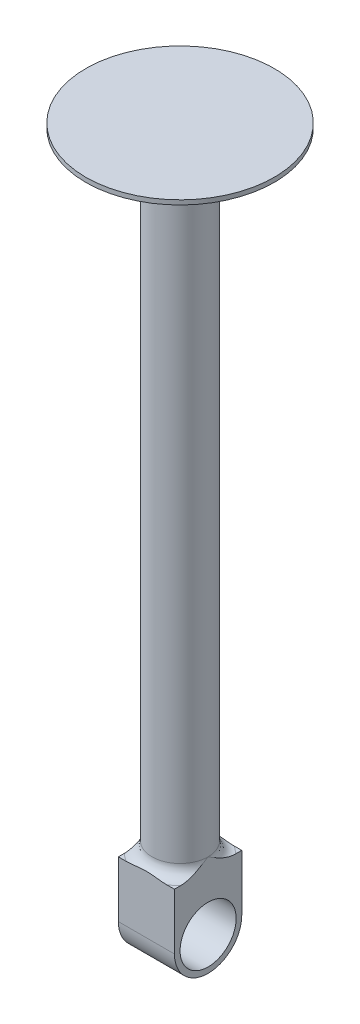
ISO-10303-21;
HEADER;
FILE_DESCRIPTION(('STEP AP214'),'2;1');
FILE_NAME('part.step','',(''),(''),'','','');
FILE_SCHEMA(('AUTOMOTIVE_DESIGN { 1 0 10303 214 1 1 1 1 }'));
ENDSEC;
DATA;
#1=APPLICATION_CONTEXT('core data for automotive mechanical design processes');
#2=APPLICATION_PROTOCOL_DEFINITION('international standard','automotive_design',2000,#1);
#3=PRODUCT_CONTEXT('',#1,'mechanical');
#4=PRODUCT('Part','Part','',(#3));
#5=PRODUCT_RELATED_PRODUCT_CATEGORY('part','',(#4));
#6=PRODUCT_DEFINITION_FORMATION('','',#4);
#7=PRODUCT_DEFINITION_CONTEXT('part definition',#1,'design');
#8=PRODUCT_DEFINITION('design','',#6,#7);
#9=PRODUCT_DEFINITION_SHAPE('','',#8);
#10=(LENGTH_UNIT() NAMED_UNIT(*) SI_UNIT(.MILLI.,.METRE.));
#11=(NAMED_UNIT(*) PLANE_ANGLE_UNIT() SI_UNIT($,.RADIAN.));
#12=(NAMED_UNIT(*) SI_UNIT($,.STERADIAN.) SOLID_ANGLE_UNIT());
#13=UNCERTAINTY_MEASURE_WITH_UNIT(LENGTH_MEASURE(1.E-05),#10,'distance_accuracy_value','');
#14=(GEOMETRIC_REPRESENTATION_CONTEXT(3) GLOBAL_UNCERTAINTY_ASSIGNED_CONTEXT((#13)) GLOBAL_UNIT_ASSIGNED_CONTEXT((#10,
#11,#12)) REPRESENTATION_CONTEXT('',''));
#15=CARTESIAN_POINT('',(0.,0.,0.));
#16=DIRECTION('',(0.,0.,1.));
#17=DIRECTION('',(1.,0.,0.));
#18=AXIS2_PLACEMENT_3D('',#15,#16,#17);
#19=CARTESIAN_POINT('',(-25.,0.,0.));
#20=DIRECTION('',(1.,0.,0.));
#21=DIRECTION('',(0.,0.,-1.));
#22=AXIS2_PLACEMENT_3D('',#19,#20,#21);
#23=CYLINDRICAL_SURFACE('',#22,12.5);
#24=CARTESIAN_POINT('',(0.,0.,0.));
#25=DIRECTION('',(1.,0.,0.));
#26=DIRECTION('',(0.,0.,-1.));
#27=AXIS2_PLACEMENT_3D('',#24,#25,#26);
#28=CIRCLE('',#27,12.5);
#29=CARTESIAN_POINT('',(0.,0.,-12.5));
#30=VERTEX_POINT('',#29);
#31=EDGE_CURVE('E249',#30,#30,#28,.T.);
#32=ORIENTED_EDGE('',*,*,#31,.T.);
#33=EDGE_LOOP('',(#32));
#34=FACE_BOUND('',#33,.T.);
#35=CARTESIAN_POINT('',(-25.,0.,0.));
#36=DIRECTION('',(1.,0.,0.));
#37=DIRECTION('',(0.,0.,-1.));
#38=AXIS2_PLACEMENT_3D('',#35,#36,#37);
#39=CIRCLE('',#38,12.5);
#40=CARTESIAN_POINT('',(-25.,0.,-12.5));
#41=VERTEX_POINT('',#40);
#42=EDGE_CURVE('E255',#41,#41,#39,.T.);
#43=ORIENTED_EDGE('',*,*,#42,.F.);
#44=EDGE_LOOP('',(#43));
#45=FACE_BOUND('',#44,.T.);
#46=DIRECTION('',(1.,0.,0.));
#47=VECTOR('',#46,1.);
#48=CARTESIAN_POINT('',(-25.,5.,11.4564392373896));
#49=LINE('',#48,#47);
#50=CARTESIAN_POINT('',(-11.5,5.,11.4564392373896));
#51=VERTEX_POINT('',#50);
#52=CARTESIAN_POINT('',(-13.5,5.,11.4564392373896));
#53=VERTEX_POINT('',#52);
#54=EDGE_CURVE('E11',#51,#53,#49,.F.);
#55=ORIENTED_EDGE('',*,*,#54,.F.);
#56=CARTESIAN_POINT('',(-11.5,5.,11.4564392373896));
#57=CARTESIAN_POINT('',(-11.2728740040052,5.04542239381407,11.4366154402754));
#58=CARTESIAN_POINT('',(-11.0498560865749,5.10491098108189,11.4103444459568));
#59=CARTESIAN_POINT('',(-10.6136001667364,5.24557323748497,11.3463573657923));
#60=CARTESIAN_POINT('',(-10.4003191938273,5.32663803601033,11.3086986146047));
#61=CARTESIAN_POINT('',(-9.98525926448562,5.50354584966557,11.223658522204));
#62=CARTESIAN_POINT('',(-9.78337570123816,5.59920682784008,11.1763948405651));
#63=CARTESIAN_POINT('',(-9.3873748171941,5.80167688837728,11.0726467235668));
#64=CARTESIAN_POINT('',(-9.19327019747175,5.90850325096414,11.0161479168376));
#65=CARTESIAN_POINT('',(-8.83517899466781,6.11656099572706,10.9018368189254));
#66=CARTESIAN_POINT('',(-8.67037200150876,6.21692712267834,10.8449945065685));
#67=CARTESIAN_POINT('',(-8.34583126530105,6.42194190502209,10.7248684907105));
#68=CARTESIAN_POINT('',(-8.18609838271885,6.52659127995346,10.6615837022662));
#69=CARTESIAN_POINT('',(-7.71384849643815,6.84491237033914,10.4622981138137));
#70=CARTESIAN_POINT('',(-7.40823536498399,7.06298405631725,10.316851588169));
#71=CARTESIAN_POINT('',(-6.81049522893945,7.50532991765513,9.99974847471668));
#72=CARTESIAN_POINT('',(-6.51852316923542,7.72964325473879,9.82785693609712));
#73=CARTESIAN_POINT('',(-5.95033772711238,8.1772561043656,9.45868118714949));
#74=CARTESIAN_POINT('',(-5.67412200183603,8.40055576306695,9.26140076625061));
#75=CARTESIAN_POINT('',(-5.11860923289969,8.85767052498424,8.82600089710703));
#76=CARTESIAN_POINT('',(-4.8404866118762,9.09110610627451,8.58597608733979));
#77=CARTESIAN_POINT('',(-4.30401074615692,9.54748193271164,8.07544749999353));
#78=CARTESIAN_POINT('',(-4.04566222574169,9.77041966492576,7.80493647680576));
#79=CARTESIAN_POINT('',(-3.55271011647963,10.1999745333179,7.23445708781987));
#80=CARTESIAN_POINT('',(-3.31798854090342,10.4066715047072,6.9346515150957));
#81=CARTESIAN_POINT('',(-2.87439966743481,10.8000788658452,6.30444735770077));
#82=CARTESIAN_POINT('',(-2.66551448072163,10.9868030722595,5.97407022065014));
#83=CARTESIAN_POINT('',(-2.34957971032795,11.2706776970793,5.4112216255197));
#84=CARTESIAN_POINT('',(-2.23340977772725,11.3754424876501,5.1876491879203));
#85=CARTESIAN_POINT('',(-2.01435486415353,11.5735285646919,4.72924184027501));
#86=CARTESIAN_POINT('',(-1.91146587027073,11.6668533074062,4.49441036176179));
#87=CARTESIAN_POINT('',(-1.72027156466832,11.8406485813402,4.01425316140931));
#88=CARTESIAN_POINT('',(-1.6319664115575,11.9211189727602,3.76892732547358));
#89=CARTESIAN_POINT('',(-1.47126406219106,12.0678058819668,3.26893345132516));
#90=CARTESIAN_POINT('',(-1.39886737697971,12.1340219418453,3.01426511330014));
#91=CARTESIAN_POINT('',(-1.27074939200222,12.251342832933,2.49518028901518));
#92=CARTESIAN_POINT('',(-1.2151588277025,12.3023291565544,2.23070448571421));
#93=CARTESIAN_POINT('',(-1.12248645426238,12.387391809185,1.69583070885546));
#94=CARTESIAN_POINT('',(-1.08540458946939,12.4214681890397,1.42543275310716));
#95=CARTESIAN_POINT('',(-1.03055036566229,12.471894734772,0.88118435112723));
#96=CARTESIAN_POINT('',(-1.0127675767528,12.4882544753309,0.607335850726652));
#97=CARTESIAN_POINT('',(-0.996875062604844,12.5028745822008,0.0585984058329272));
#98=CARTESIAN_POINT('',(-0.99876337631593,12.5011367526939,-0.216290432215732));
#99=CARTESIAN_POINT('',(-1.02082714997337,12.4808411251686,-0.733311953360356));
#100=CARTESIAN_POINT('',(-1.03889910023941,12.4642180853733,-0.975615572633627));
#101=CARTESIAN_POINT('',(-1.09013205286533,12.4171246435819,-1.45723954147197));
#102=CARTESIAN_POINT('',(-1.12329169105975,12.3866554934932,-1.69656015873813));
#103=CARTESIAN_POINT('',(-1.20415163592183,12.3124300380011,-2.17063183615225));
#104=CARTESIAN_POINT('',(-1.25185247803207,12.2686732433144,-2.40538272769306));
#105=CARTESIAN_POINT('',(-1.36105900221549,12.1686288252706,-2.86891984323233));
#106=CARTESIAN_POINT('',(-1.42256536490273,12.1123405841127,-3.09770577253645));
#107=CARTESIAN_POINT('',(-1.55960690210822,11.9871352998546,-3.55175106890628));
#108=CARTESIAN_POINT('',(-1.63535096305812,11.9180304521317,-3.77689528785399));
#109=CARTESIAN_POINT('',(-1.79924772664514,11.7688125978446,-4.21894527719511));
#110=CARTESIAN_POINT('',(-1.88740517730516,11.688695379417,-4.43584785472547));
#111=CARTESIAN_POINT('',(-2.07512862991007,11.518522976182,-4.86065773599934));
#112=CARTESIAN_POINT('',(-2.17469653109244,11.428466137045,-5.06856353429742));
#113=CARTESIAN_POINT('',(-2.38427253033225,11.2394792006493,-5.47488249521318));
#114=CARTESIAN_POINT('',(-2.49428283958546,11.1405472243115,-5.67329363388356));
#115=CARTESIAN_POINT('',(-2.78101579756932,10.8836028898364,-6.15669786635003));
#116=CARTESIAN_POINT('',(-2.96367823108143,10.7207039938588,-6.43560211221801));
#117=CARTESIAN_POINT('',(-3.34770050180345,10.3805889726437,-6.97094237944979));
#118=CARTESIAN_POINT('',(-3.54906823916317,10.2033668021418,-7.22736881766987));
#119=CARTESIAN_POINT('',(-3.96856576585294,9.83741962743175,-7.71809468994671));
#120=CARTESIAN_POINT('',(-4.18672062798082,9.64867750782822,-7.95235981379859));
#121=CARTESIAN_POINT('',(-4.63779237881762,9.26286339918523,-8.3985918566529));
#122=CARTESIAN_POINT('',(-4.87070720323347,9.06579257625684,-8.6105618828135));
#123=CARTESIAN_POINT('',(-5.3555927998184,8.66164945983531,-9.01719573716815));
#124=CARTESIAN_POINT('',(-5.60787421465243,8.45445192728502,-9.21136350117502));
#125=CARTESIAN_POINT('',(-6.12623855850397,8.03747833840816,-9.57736280216772));
#126=CARTESIAN_POINT('',(-6.39232464260466,7.82770170105596,-9.74918920124949));
#127=CARTESIAN_POINT('',(-6.93885345944115,7.40914194500368,-10.0709670996502));
#128=CARTESIAN_POINT('',(-7.21931539286914,7.2003605847804,-10.2208882561994));
#129=CARTESIAN_POINT('',(-7.79537704603918,6.78914860461928,-10.4985140719855));
#130=CARTESIAN_POINT('',(-8.09096884354462,6.58671474878903,-10.6262302071603));
#131=CARTESIAN_POINT('',(-8.57923099292969,6.27317637768589,-10.8127807152782));
#132=CARTESIAN_POINT('',(-8.76630608038481,6.15764959241839,-10.8788646687185));
#133=CARTESIAN_POINT('',(-9.14779353376644,5.93408246928659,-11.0024062208337));
#134=CARTESIAN_POINT('',(-9.34220813845065,5.82604444467316,-11.0598611603753));
#135=CARTESIAN_POINT('',(-9.73780372575917,5.62149932054787,-11.1652089707488));
#136=CARTESIAN_POINT('',(-9.93892952121163,5.52491860760054,-11.213164380457));
#137=CARTESIAN_POINT('',(-10.3497336944899,5.34691169636815,-11.2991279481419));
#138=CARTESIAN_POINT('',(-10.559401553518,5.26546750777402,-11.337147936847));
#139=CARTESIAN_POINT('',(-10.8917507833178,5.15500022450754,-11.387619048434));
#140=CARTESIAN_POINT('',(-11.0114712990799,5.11880810246956,-11.4039068804532));
#141=CARTESIAN_POINT('',(-11.2537559850222,5.05365380738767,-11.4329278072207));
#142=CARTESIAN_POINT('',(-11.3763290090656,5.02471877087496,-11.4456475802585));
#143=CARTESIAN_POINT('',(-11.5,5.,-11.4564392373896));
#144=B_SPLINE_CURVE_WITH_KNOTS('',3,(#56,#57,#58,#59,#60,#61,#62,#63,#64,#65,#66,#67,#68,#69,
#70,#71,#72,#73,#74,#75,#76,#77,#78,#79,#80,#81,#82,#83,#84,#85,#86,#87,#88,#89,#90,#91,#92,#93,
#94,#95,#96,#97,#98,#99,#100,#101,#102,#103,#104,#105,#106,#107,#108,#109,#110,#111,#112,#113,
#114,#115,#116,#117,#118,#119,#120,#121,#122,#123,#124,#125,#126,#127,#128,#129,#130,#131,#132,
#133,#134,#135,#136,#137,#138,#139,#140,#141,#142,#143),.UNSPECIFIED.,.F.,.F.,(4,2,2,2,2,2,2,2,
2,2,2,2,2,2,2,2,2,2,2,2,2,2,2,2,2,2,2,2,2,2,2,2,2,2,2,2,2,2,2,2,2,2,2,4),(0.,0.695839517983713,
1.38823238623275,2.07260590217581,2.75805473595694,3.36130605035763,3.96465912370432,
5.17120273874328,6.38916127817254,7.60693824101879,8.91120407605498,10.2157805501635,
11.5134802910089,12.8102764288754,13.6281841156786,14.4458440857037,15.26351294773,
16.081208072745,16.9051094419023,17.7290083337104,18.5524617396799,19.3758330547652,
20.1055936668308,20.8352883101104,21.5650098257716,22.2947673247076,23.0362112954698,
23.7779396369303,24.5197916168004,25.2618010368823,26.3733305169624,27.4853316025901,
28.5990270419995,29.7125670649191,30.8511353894104,31.9899650921537,33.1303576241473,
34.270159018248,34.9586109325505,35.6472745680922,36.3312416796435,37.0143905987802,
37.3925103506863,37.7720236104744),.UNSPECIFIED.);
#145=CARTESIAN_POINT('',(-11.5,5.,-11.4564392373896));
#146=VERTEX_POINT('',#145);
#147=EDGE_CURVE('E43',#51,#146,#144,.T.);
#148=ORIENTED_EDGE('',*,*,#147,.T.);
#149=DIRECTION('',(1.,0.,0.));
#150=VECTOR('',#149,1.);
#151=CARTESIAN_POINT('',(-25.,5.,-11.4564392373896));
#152=LINE('',#151,#150);
#153=CARTESIAN_POINT('',(-13.5,5.,-11.4564392373896));
#154=VERTEX_POINT('',#153);
#155=EDGE_CURVE('E133',#154,#146,#152,.T.);
#156=ORIENTED_EDGE('',*,*,#155,.F.);
#157=CARTESIAN_POINT('',(-13.5,5.,-11.4564392373896));
#158=CARTESIAN_POINT('',(-13.7271259959948,5.04542239381406,-11.4366154402754));
#159=CARTESIAN_POINT('',(-13.9501439134251,5.10491098108189,-11.4103444459568));
#160=CARTESIAN_POINT('',(-14.3863998332636,5.24557323748497,-11.3463573657923));
#161=CARTESIAN_POINT('',(-14.5996808061727,5.32663803601033,-11.3086986146047));
#162=CARTESIAN_POINT('',(-15.0147407355144,5.50354584966558,-11.223658522204));
#163=CARTESIAN_POINT('',(-15.2166242987618,5.59920682784008,-11.1763948405651));
#164=CARTESIAN_POINT('',(-15.6126251828059,5.80167688837728,-11.0726467235668));
#165=CARTESIAN_POINT('',(-15.8067298025283,5.90850325096415,-11.0161479168376));
#166=CARTESIAN_POINT('',(-16.1648210053322,6.11656099572706,-10.9018368189254));
#167=CARTESIAN_POINT('',(-16.3296279984912,6.21692712267834,-10.8449945065685));
#168=CARTESIAN_POINT('',(-16.6541687346989,6.42194190502209,-10.7248684907105));
#169=CARTESIAN_POINT('',(-16.8139016172812,6.52659127995346,-10.6615837022662));
#170=CARTESIAN_POINT('',(-17.2861515035619,6.84491237033914,-10.4622981138137));
#171=CARTESIAN_POINT('',(-17.591764635016,7.06298405631725,-10.316851588169));
#172=CARTESIAN_POINT('',(-18.1895047710605,7.50532991765513,-9.99974847471668));
#173=CARTESIAN_POINT('',(-18.4814768307646,7.7296432547388,-9.82785693609712));
#174=CARTESIAN_POINT('',(-19.0496622728876,8.1772561043656,-9.45868118714949));
#175=CARTESIAN_POINT('',(-19.325877998164,8.40055576306695,-9.26140076625061));
#176=CARTESIAN_POINT('',(-19.8813907671003,8.85767052498424,-8.82600089710703));
#177=CARTESIAN_POINT('',(-20.1595133881238,9.09110610627451,-8.58597608733979));
#178=CARTESIAN_POINT('',(-20.6959892538431,9.54748193271164,-8.07544749999352));
#179=CARTESIAN_POINT('',(-20.9543377742583,9.77041966492577,-7.80493647680575));
#180=CARTESIAN_POINT('',(-21.4472898835204,10.1999745333179,-7.23445708781986));
#181=CARTESIAN_POINT('',(-21.6820114590966,10.4066715047072,-6.93465151509569));
#182=CARTESIAN_POINT('',(-22.1256003325652,10.8000788658452,-6.30444735770076));
#183=CARTESIAN_POINT('',(-22.3344855192784,10.9868030722595,-5.97407022065013));
#184=CARTESIAN_POINT('',(-22.6504202896721,11.2706776970793,-5.41122162551969));
#185=CARTESIAN_POINT('',(-22.7665902222728,11.3754424876501,-5.18764918792029));
#186=CARTESIAN_POINT('',(-22.9856451358465,11.5735285646919,-4.72924184027501));
#187=CARTESIAN_POINT('',(-23.0885341297293,11.6668533074062,-4.49441036176178));
#188=CARTESIAN_POINT('',(-23.2797284353317,11.8406485813402,-4.0142531614093));
#189=CARTESIAN_POINT('',(-23.3680335884425,11.9211189727602,-3.76892732547358));
#190=CARTESIAN_POINT('',(-23.5287359378089,12.0678058819668,-3.26893345132516));
#191=CARTESIAN_POINT('',(-23.6011326230203,12.1340219418453,-3.01426511330013));
#192=CARTESIAN_POINT('',(-23.7292506079978,12.251342832933,-2.49518028901517));
#193=CARTESIAN_POINT('',(-23.7848411722975,12.3023291565544,-2.23070448571421));
#194=CARTESIAN_POINT('',(-23.8775135457376,12.387391809185,-1.69583070885546));
#195=CARTESIAN_POINT('',(-23.9145954105306,12.4214681890397,-1.42543275310716));
#196=CARTESIAN_POINT('',(-23.9694496343377,12.471894734772,-0.881184351127229));
#197=CARTESIAN_POINT('',(-23.9872324232472,12.4882544753309,-0.607335850726652));
#198=CARTESIAN_POINT('',(-24.0031249373952,12.5028745822008,-0.0585984058329279));
#199=CARTESIAN_POINT('',(-24.0012366236841,12.5011367526939,0.216290432215731));
#200=CARTESIAN_POINT('',(-23.9791728500266,12.4808411251686,0.733311953360354));
#201=CARTESIAN_POINT('',(-23.9611008997606,12.4642180853733,0.975615572633624));
#202=CARTESIAN_POINT('',(-23.9098679471347,12.4171246435819,1.45723954147196));
#203=CARTESIAN_POINT('',(-23.8767083089403,12.3866554934932,1.69656015873813));
#204=CARTESIAN_POINT('',(-23.7958483640782,12.3124300380011,2.17063183615224));
#205=CARTESIAN_POINT('',(-23.7481475219679,12.2686732433144,2.40538272769305));
#206=CARTESIAN_POINT('',(-23.6389409977845,12.1686288252706,2.86891984323233));
#207=CARTESIAN_POINT('',(-23.5774346350973,12.1123405841127,3.09770577253645));
#208=CARTESIAN_POINT('',(-23.4403930978918,11.9871352998546,3.55175106890628));
#209=CARTESIAN_POINT('',(-23.3646490369419,11.9180304521317,3.77689528785399));
#210=CARTESIAN_POINT('',(-23.2007522733549,11.7688125978446,4.21894527719511));
#211=CARTESIAN_POINT('',(-23.1125948226948,11.688695379417,4.43584785472546));
#212=CARTESIAN_POINT('',(-22.9248713700899,11.518522976182,4.86065773599933));
#213=CARTESIAN_POINT('',(-22.8253034689076,11.428466137045,5.06856353429742));
#214=CARTESIAN_POINT('',(-22.6157274696677,11.2394792006493,5.47488249521318));
#215=CARTESIAN_POINT('',(-22.5057171604145,11.1405472243115,5.67329363388356));
#216=CARTESIAN_POINT('',(-22.2189842024307,10.8836028898364,6.15669786635003));
#217=CARTESIAN_POINT('',(-22.0363217689186,10.7207039938588,6.43560211221801));
#218=CARTESIAN_POINT('',(-21.6522994981966,10.3805889726437,6.97094237944978));
#219=CARTESIAN_POINT('',(-21.4509317608368,10.2033668021418,7.22736881766986));
#220=CARTESIAN_POINT('',(-21.0314342341471,9.83741962743176,7.7180946899467));
#221=CARTESIAN_POINT('',(-20.8132793720192,9.64867750782822,7.95235981379859));
#222=CARTESIAN_POINT('',(-20.3622076211824,9.26286339918523,8.3985918566529));
#223=CARTESIAN_POINT('',(-20.1292927967665,9.06579257625685,8.6105618828135));
#224=CARTESIAN_POINT('',(-19.6444072001816,8.66164945983531,9.01719573716815));
#225=CARTESIAN_POINT('',(-19.3921257853476,8.45445192728502,9.21136350117502));
#226=CARTESIAN_POINT('',(-18.873761441496,8.03747833840816,9.57736280216771));
#227=CARTESIAN_POINT('',(-18.6076753573953,7.82770170105597,9.74918920124948));
#228=CARTESIAN_POINT('',(-18.0611465405589,7.40914194500369,10.0709670996502));
#229=CARTESIAN_POINT('',(-17.7806846071309,7.20036058478041,10.2208882561994));
#230=CARTESIAN_POINT('',(-17.2046229539608,6.78914860461928,10.4985140719855));
#231=CARTESIAN_POINT('',(-16.9090311564554,6.58671474878904,10.6262302071603));
#232=CARTESIAN_POINT('',(-16.4207690070703,6.27317637768589,10.8127807152782));
#233=CARTESIAN_POINT('',(-16.2336939196152,6.1576495924184,10.8788646687185));
#234=CARTESIAN_POINT('',(-15.8522064662336,5.93408246928659,11.0024062208337));
#235=CARTESIAN_POINT('',(-15.6577918615494,5.82604444467316,11.0598611603753));
#236=CARTESIAN_POINT('',(-15.2621962742408,5.62149932054787,11.1652089707488));
#237=CARTESIAN_POINT('',(-15.0610704787884,5.52491860760055,11.213164380457));
#238=CARTESIAN_POINT('',(-14.6502663055101,5.34691169636815,11.2991279481419));
#239=CARTESIAN_POINT('',(-14.440598446482,5.26546750777401,11.337147936847));
#240=CARTESIAN_POINT('',(-14.1082492166822,5.15500022450754,11.387619048434));
#241=CARTESIAN_POINT('',(-13.9885287009201,5.11880810246956,11.4039068804532));
#242=CARTESIAN_POINT('',(-13.7462440149778,5.05365380738767,11.4329278072207));
#243=CARTESIAN_POINT('',(-13.6236709909344,5.02471877087497,11.4456475802585));
#244=CARTESIAN_POINT('',(-13.5,5.,11.4564392373896));
#245=B_SPLINE_CURVE_WITH_KNOTS('',3,(#157,#158,#159,#160,#161,#162,#163,#164,#165,#166,#167,
#168,#169,#170,#171,#172,#173,#174,#175,#176,#177,#178,#179,#180,#181,#182,#183,#184,#185,#186,
#187,#188,#189,#190,#191,#192,#193,#194,#195,#196,#197,#198,#199,#200,#201,#202,#203,#204,#205,
#206,#207,#208,#209,#210,#211,#212,#213,#214,#215,#216,#217,#218,#219,#220,#221,#222,#223,#224,
#225,#226,#227,#228,#229,#230,#231,#232,#233,#234,#235,#236,#237,#238,#239,#240,#241,#242,#243,
#244),.UNSPECIFIED.,.F.,.F.,(4,2,2,2,2,2,2,2,2,2,2,2,2,2,2,2,2,2,2,2,2,2,2,2,2,2,2,2,2,2,2,2,2,
2,2,2,2,2,2,2,2,2,2,4),(0.,0.695839517983714,1.38823238623275,2.07260590217582,2.75805473595694,
3.36130605035763,3.96465912370433,5.17120273874328,6.38916127817254,7.60693824101879,
8.91120407605499,10.2157805501635,11.5134802910089,12.8102764288754,13.6281841156787,
14.4458440857037,15.26351294773,16.081208072745,16.9051094419023,17.7290083337104,
18.5524617396799,19.3758330547652,20.1055936668308,20.8352883101104,21.5650098257716,
22.2947673247076,23.0362112954697,23.7779396369303,24.5197916168004,25.2618010368823,
26.3733305169623,27.4853316025901,28.5990270419995,29.7125670649191,30.8511353894104,
31.9899650921537,33.1303576241473,34.270159018248,34.9586109325505,35.6472745680922,
36.3312416796435,37.0143905987802,37.3925103506863,37.7720236104744),.UNSPECIFIED.);
#246=EDGE_CURVE('E128',#154,#53,#245,.T.);
#247=ORIENTED_EDGE('',*,*,#246,.T.);
#248=EDGE_LOOP('',(#55,#148,#156,#247));
#249=FACE_BOUND('',#248,.T.);
#250=ADVANCED_FACE('F34',(#34,#45,#249),#23,.F.);
#251=CARTESIAN_POINT('',(-12.5,30.,0.));
#252=DIRECTION('',(0.,1.,0.));
#253=DIRECTION('',(0.,0.,1.));
#254=AXIS2_PLACEMENT_3D('',#251,#252,#253);
#255=TOROIDAL_SURFACE('',#254,17.5,5.);
#256=CARTESIAN_POINT('',(-21.51387818866,25.,-15.));
#257=CARTESIAN_POINT('',(-21.0950038378221,25.0000501276346,-15.));
#258=CARTESIAN_POINT('',(-20.6765744182583,25.013944856336,-15.));
#259=CARTESIAN_POINT('',(-19.8411641137872,25.0612794436267,-15.));
#260=CARTESIAN_POINT('',(-19.4241822209844,25.0947004370346,-15.));
#261=CARTESIAN_POINT('',(-18.5892064137597,25.1731826870119,-15.));
#262=CARTESIAN_POINT('',(-18.1712188793809,25.2183047998535,-15.));
#263=CARTESIAN_POINT('',(-17.3354698794261,25.3120426107479,-15.));
#264=CARTESIAN_POINT('',(-16.9177085823411,25.3606597670034,-15.));
#265=CARTESIAN_POINT('',(-16.0849924204971,25.4529396054772,-15.));
#266=CARTESIAN_POINT('',(-15.6700419027632,25.4966388783842,-15.));
#267=CARTESIAN_POINT('',(-15.0468329830221,25.5533432381571,-15.));
#268=CARTESIAN_POINT('',(-14.8389858454726,25.5707693698985,-15.));
#269=CARTESIAN_POINT('',(-14.4230165390977,25.6019105474394,-15.));
#270=CARTESIAN_POINT('',(-14.2148943789958,25.6156257082369,-15.));
#271=CARTESIAN_POINT('',(-13.7991543930238,25.6386627398711,-15.));
#272=CARTESIAN_POINT('',(-13.5915374476358,25.6480002437139,-15.));
#273=CARTESIAN_POINT('',(-13.1761419188188,25.6619121245783,-15.));
#274=CARTESIAN_POINT('',(-12.9683633356335,25.6664865087665,-15.));
#275=CARTESIAN_POINT('',(-12.5527496041894,25.6706481518719,-15.));
#276=CARTESIAN_POINT('',(-12.3449144545969,25.6702352807397,-15.));
#277=CARTESIAN_POINT('',(-11.9293168348246,25.6644487903035,-15.));
#278=CARTESIAN_POINT('',(-11.7215543643224,25.6590751932952,-15.));
#279=CARTESIAN_POINT('',(-11.1681502573562,25.6384611175918,-15.));
#280=CARTESIAN_POINT('',(-10.8226614815711,25.6190361947237,-15.));
#281=CARTESIAN_POINT('',(-10.1324801567527,25.5695595351963,-15.));
#282=CARTESIAN_POINT('',(-9.78778762283292,25.5395075984677,-15.));
#283=CARTESIAN_POINT('',(-9.09814359997528,25.4723551116409,-15.));
#284=CARTESIAN_POINT('',(-8.75319407561016,25.4352351135748,-15.));
#285=CARTESIAN_POINT('',(-8.06357718092725,25.3582841107538,-15.));
#286=CARTESIAN_POINT('',(-7.71890984077816,25.3184528468385,-15.));
#287=CARTESIAN_POINT('',(-7.02665185339485,25.2402859979805,-15.));
#288=CARTESIAN_POINT('',(-6.67905951923887,25.2019646271645,-15.));
#289=CARTESIAN_POINT('',(-5.98324076499566,25.1318178954902,-15.));
#290=CARTESIAN_POINT('',(-5.63501442576995,25.0999917577798,-15.));
#291=CARTESIAN_POINT('',(-4.9383512282267,25.0475491542006,-15.));
#292=CARTESIAN_POINT('',(-4.58991623656299,25.0269100345741,-15.));
#293=CARTESIAN_POINT('',(-3.89209336925033,25.0014950604482,-15.));
#294=CARTESIAN_POINT('',(-3.54270485464265,24.9967379189917,-15.));
#295=CARTESIAN_POINT('',(-3.19323196777712,25.0023306409643,-15.));
#296=B_SPLINE_CURVE_WITH_KNOTS('',3,(#256,#257,#258,#259,#260,#261,#262,#263,#264,#265,#266,
#267,#268,#269,#270,#271,#272,#273,#274,#275,#276,#277,#278,#279,#280,#281,#282,#283,#284,#285,
#286,#287,#288,#289,#290,#291,#292,#293,#294,#295),.UNSPECIFIED.,.F.,.F.,(4,2,2,2,2,2,2,2,2,2,2,
2,2,2,2,2,2,2,2,4),(0.,1.2557742047959,2.51033715262873,3.77156058646075,5.03331331670677,
6.28495196365701,6.91065295463471,7.53633455375279,8.15976444058162,8.78319338938949,
9.40663859498282,10.0300809985661,11.0679537915834,12.1058461251514,13.1466366315495,
14.1875267635786,15.2365969823997,16.2855416551851,17.3323541987987,18.3803997215399),.UNSPECIFIED.);
#297=CARTESIAN_POINT('',(-21.51387818866,25.,-15.));
#298=VERTEX_POINT('',#297);
#299=CARTESIAN_POINT('',(-3.48612181134002,25.,-15.));
#300=VERTEX_POINT('',#299);
#301=EDGE_CURVE('E195',#298,#300,#296,.T.);
#302=ORIENTED_EDGE('',*,*,#301,.F.);
#303=CARTESIAN_POINT('',(-12.5,25.,0.));
#304=DIRECTION('',(0.,1.,0.));
#305=DIRECTION('',(0.,0.,1.));
#306=AXIS2_PLACEMENT_3D('',#303,#304,#305);
#307=CIRCLE('',#306,17.5);
#308=CARTESIAN_POINT('',(-25.,25.,-12.2474487139159));
#309=VERTEX_POINT('',#308);
#310=EDGE_CURVE('E219',#309,#298,#307,.F.);
#311=ORIENTED_EDGE('',*,*,#310,.F.);
#312=CARTESIAN_POINT('',(-25.,25.,-12.2474487139159));
#313=CARTESIAN_POINT('',(-25.,25.0000033703014,-12.0786126410343));
#314=CARTESIAN_POINT('',(-25.,25.0041881494309,-11.909810622488));
#315=CARTESIAN_POINT('',(-25.,25.0204073865853,-11.5726522044278));
#316=CARTESIAN_POINT('',(-25.,25.0324385072044,-11.404295645995));
#317=CARTESIAN_POINT('',(-25.,25.0794714626882,-10.9009564977467));
#318=CARTESIAN_POINT('',(-25.,25.1254173001425,-10.5669867731725));
#319=CARTESIAN_POINT('',(-25.,25.2994734375395,-9.58256242157538));
#320=CARTESIAN_POINT('',(-25.,25.4640708796591,-8.93847840020314));
#321=CARTESIAN_POINT('',(-25.,25.782892840217,-7.93625830967232));
#322=CARTESIAN_POINT('',(-25.,25.9132800335379,-7.56997691565989));
#323=CARTESIAN_POINT('',(-25.,26.1949330354161,-6.84547116096679));
#324=CARTESIAN_POINT('',(-25.,26.3461990955577,-6.48724689743264));
#325=CARTESIAN_POINT('',(-25.,26.665936634512,-5.77809035735199));
#326=CARTESIAN_POINT('',(-25.,26.8344306269647,-5.42716836278172));
#327=CARTESIAN_POINT('',(-25.,27.1850715085713,-4.73218094625973));
#328=CARTESIAN_POINT('',(-25.,27.3672205861135,-4.38811663456513));
#329=CARTESIAN_POINT('',(-25.,27.9324049211284,-3.35922026412901));
#330=CARTESIAN_POINT('',(-25.,28.331533052632,-2.68329464019022));
#331=CARTESIAN_POINT('',(-25.,29.1497662050445,-1.34453426367762));
#332=CARTESIAN_POINT('',(-25.,29.5688607304291,-0.681692886853363));
#333=CARTESIAN_POINT('',(-25.,29.9920318094424,-0.0125988169459396));
#334=CARTESIAN_POINT('',(-25.,29.9960159048341,-0.00629940907500695));
#335=CARTESIAN_POINT('',(-25.,30.,0.));
#336=B_SPLINE_CURVE_WITH_KNOTS('',3,(#312,#313,#314,#315,#316,#317,#318,#319,#320,#321,#322,
#323,#324,#325,#326,#327,#328,#329,#330,#331,#332,#333,#334,#335),.UNSPECIFIED.,.F.,.F.,(4,2,2,
2,2,2,2,2,2,2,2,4),(0.,0.506402523826368,1.01258979198716,2.02281953724405,4.01030959918914,
5.17623670193196,6.34217785497735,7.50966263302707,8.67733491590851,11.0312449799256,
13.3839310548634,13.4062917346492),.UNSPECIFIED.);
#337=CARTESIAN_POINT('',(-25.,30.,0.));
#338=VERTEX_POINT('',#337);
#339=EDGE_CURVE('E57',#309,#338,#336,.T.);
#340=ORIENTED_EDGE('',*,*,#339,.T.);
#341=CARTESIAN_POINT('',(-12.5,30.,0.));
#342=DIRECTION('',(0.,1.,0.));
#343=DIRECTION('',(0.,0.,1.));
#344=AXIS2_PLACEMENT_3D('',#341,#342,#343);
#345=CIRCLE('',#344,12.5);
#346=CARTESIAN_POINT('',(0.,30.,0.));
#347=VERTEX_POINT('',#346);
#348=EDGE_CURVE('E212',#347,#338,#345,.T.);
#349=ORIENTED_EDGE('',*,*,#348,.F.);
#350=CARTESIAN_POINT('',(0.,25.,-12.2474487139159));
#351=CARTESIAN_POINT('',(0.,25.0000033703014,-12.0786126410342));
#352=CARTESIAN_POINT('',(0.,25.0041881494309,-11.9098106224879));
#353=CARTESIAN_POINT('',(0.,25.0204073865853,-11.5726522044275));
#354=CARTESIAN_POINT('',(0.,25.0324385072044,-11.4042956459947));
#355=CARTESIAN_POINT('',(0.,25.0794714626882,-10.9009564977463));
#356=CARTESIAN_POINT('',(0.,25.1254173001425,-10.566986773172));
#357=CARTESIAN_POINT('',(0.,25.2994734375396,-9.58256242157499));
#358=CARTESIAN_POINT('',(0.,25.4640708796591,-8.93847840020295));
#359=CARTESIAN_POINT('',(0.,25.782892840217,-7.93625830967234));
#360=CARTESIAN_POINT('',(0.,25.9132800335379,-7.56997691565992));
#361=CARTESIAN_POINT('',(0.,26.1949330354161,-6.84547116096686));
#362=CARTESIAN_POINT('',(0.,26.3461990955577,-6.48724689743273));
#363=CARTESIAN_POINT('',(0.,26.665936634512,-5.77809035735214));
#364=CARTESIAN_POINT('',(0.,26.8344306269646,-5.42716836278191));
#365=CARTESIAN_POINT('',(0.,27.1850715085711,-4.73218094626004));
#366=CARTESIAN_POINT('',(0.,27.3672205861134,-4.38811663456551));
#367=CARTESIAN_POINT('',(0.,27.9324049211281,-3.35922026412926));
#368=CARTESIAN_POINT('',(0.,28.3315330526311,-2.68329464019003));
#369=CARTESIAN_POINT('',(0.,29.1497662050452,-1.34453426367827));
#370=CARTESIAN_POINT('',(0.,29.568860730432,-0.681692886855292));
#371=CARTESIAN_POINT('',(0.,29.9920318094425,-0.0125988169459874));
#372=CARTESIAN_POINT('',(0.,29.9960159048341,-0.00629940907503102));
#373=CARTESIAN_POINT('',(0.,30.,0.));
#374=B_SPLINE_CURVE_WITH_KNOTS('',3,(#350,#351,#352,#353,#354,#355,#356,#357,#358,#359,#360,
#361,#362,#363,#364,#365,#366,#367,#368,#369,#370,#371,#372,#373),.UNSPECIFIED.,.F.,.F.,(4,2,2,
2,2,2,2,2,2,2,2,4),(0.,0.506402523826534,1.0125897919875,2.02281953724464,4.01030959918914,
5.17623670193191,6.34217785497724,7.50966263302678,8.67733491590806,11.0312449799253,
13.3839310548633,13.4062917346492),.UNSPECIFIED.);
#375=CARTESIAN_POINT('',(0.,25.,-12.2474487139159));
#376=VERTEX_POINT('',#375);
#377=EDGE_CURVE('E135',#347,#376,#374,.F.);
#378=ORIENTED_EDGE('',*,*,#377,.T.);
#379=CARTESIAN_POINT('',(-12.5,25.,0.));
#380=DIRECTION('',(0.,1.,0.));
#381=DIRECTION('',(0.,0.,1.));
#382=AXIS2_PLACEMENT_3D('',#379,#380,#381);
#383=CIRCLE('',#382,17.5);
#384=EDGE_CURVE('E209',#300,#376,#383,.F.);
#385=ORIENTED_EDGE('',*,*,#384,.F.);
#386=EDGE_LOOP('',(#302,#311,#340,#349,#378,#385));
#387=FACE_BOUND('',#386,.T.);
#388=ADVANCED_FACE('F36',(#387),#255,.F.);
#389=CARTESIAN_POINT('',(0.,25.,0.));
#390=DIRECTION('',(0.,1.,0.));
#391=DIRECTION('',(0.,0.,1.));
#392=AXIS2_PLACEMENT_3D('',#389,#390,#391);
#393=PLANE('',#392);
#394=DIRECTION('',(0.,0.,1.));
#395=VECTOR('',#394,1.);
#396=CARTESIAN_POINT('',(-25.,25.,0.));
#397=LINE('',#396,#395);
#398=CARTESIAN_POINT('',(-25.,25.,-15.));
#399=VERTEX_POINT('',#398);
#400=EDGE_CURVE('E229',#399,#309,#397,.T.);
#401=ORIENTED_EDGE('',*,*,#400,.T.);
#402=ORIENTED_EDGE('',*,*,#310,.T.);
#403=DIRECTION('',(-1.,0.,0.));
#404=VECTOR('',#403,1.);
#405=CARTESIAN_POINT('',(0.,25.,-15.));
#406=LINE('',#405,#404);
#407=EDGE_CURVE('E224',#298,#399,#406,.T.);
#408=ORIENTED_EDGE('',*,*,#407,.T.);
#409=EDGE_LOOP('',(#401,#402,#408));
#410=FACE_BOUND('',#409,.T.);
#411=ADVANCED_FACE('F163',(#410),#393,.T.);
#412=CARTESIAN_POINT('',(-12.5,30.,0.));
#413=DIRECTION('',(0.,1.,0.));
#414=DIRECTION('',(0.,0.,1.));
#415=AXIS2_PLACEMENT_3D('',#412,#413,#414);
#416=TOROIDAL_SURFACE('',#415,17.5,5.);
#417=CARTESIAN_POINT('',(-3.48612181134002,25.,15.));
#418=CARTESIAN_POINT('',(-3.90499616217794,25.0000501276346,15.));
#419=CARTESIAN_POINT('',(-4.32342558174172,25.013944856336,15.));
#420=CARTESIAN_POINT('',(-5.1588358862128,25.0612794436267,15.));
#421=CARTESIAN_POINT('',(-5.57581777901557,25.0947004370346,15.));
#422=CARTESIAN_POINT('',(-6.41079358624034,25.1731826870119,15.));
#423=CARTESIAN_POINT('',(-6.8287811206191,25.2183047998535,15.));
#424=CARTESIAN_POINT('',(-7.66453012057385,25.3120426107479,15.));
#425=CARTESIAN_POINT('',(-8.08229141765892,25.3606597670034,15.));
#426=CARTESIAN_POINT('',(-8.91500757950288,25.4529396054772,15.));
#427=CARTESIAN_POINT('',(-9.32995809723683,25.4966388783842,15.));
#428=CARTESIAN_POINT('',(-9.95316701697788,25.5533432381571,15.));
#429=CARTESIAN_POINT('',(-10.1610141545274,25.5707693698985,15.));
#430=CARTESIAN_POINT('',(-10.5769834609024,25.6019105474394,15.));
#431=CARTESIAN_POINT('',(-10.7851056210042,25.6156257082369,15.));
#432=CARTESIAN_POINT('',(-11.2008456069762,25.6386627398711,15.));
#433=CARTESIAN_POINT('',(-11.4084625523642,25.6480002437139,15.));
#434=CARTESIAN_POINT('',(-11.8238580811812,25.6619121245783,15.));
#435=CARTESIAN_POINT('',(-12.0316366643665,25.6664865087665,15.));
#436=CARTESIAN_POINT('',(-12.4472503958106,25.6706481518719,15.));
#437=CARTESIAN_POINT('',(-12.6550855454031,25.6702352807397,15.));
#438=CARTESIAN_POINT('',(-13.0706831651754,25.6644487903035,15.));
#439=CARTESIAN_POINT('',(-13.2784456356776,25.6590751932952,15.));
#440=CARTESIAN_POINT('',(-13.8318497426438,25.6384611175918,15.));
#441=CARTESIAN_POINT('',(-14.1773385184289,25.6190361947237,15.));
#442=CARTESIAN_POINT('',(-14.8675198432473,25.5695595351963,15.));
#443=CARTESIAN_POINT('',(-15.2122123771671,25.5395075984677,15.));
#444=CARTESIAN_POINT('',(-15.9018564000247,25.4723551116409,15.));
#445=CARTESIAN_POINT('',(-16.2468059243898,25.4352351135748,15.));
#446=CARTESIAN_POINT('',(-16.9364228190727,25.3582841107538,15.));
#447=CARTESIAN_POINT('',(-17.2810901592218,25.3184528468385,15.));
#448=CARTESIAN_POINT('',(-17.9733481466051,25.2402859979805,15.));
#449=CARTESIAN_POINT('',(-18.3209404807611,25.2019646271645,15.));
#450=CARTESIAN_POINT('',(-19.0167592350043,25.1318178954902,15.));
#451=CARTESIAN_POINT('',(-19.36498557423,25.0999917577798,15.));
#452=CARTESIAN_POINT('',(-20.0616487717733,25.0475491542006,15.));
#453=CARTESIAN_POINT('',(-20.410083763437,25.0269100345741,15.));
#454=CARTESIAN_POINT('',(-21.1079066307497,25.0014950604482,15.));
#455=CARTESIAN_POINT('',(-21.4572951453573,24.9967379189917,15.));
#456=CARTESIAN_POINT('',(-21.8067680322229,25.0023306409643,15.));
#457=B_SPLINE_CURVE_WITH_KNOTS('',3,(#417,#418,#419,#420,#421,#422,#423,#424,#425,#426,#427,
#428,#429,#430,#431,#432,#433,#434,#435,#436,#437,#438,#439,#440,#441,#442,#443,#444,#445,#446,
#447,#448,#449,#450,#451,#452,#453,#454,#455,#456),.UNSPECIFIED.,.F.,.F.,(4,2,2,2,2,2,2,2,2,2,2,
2,2,2,2,2,2,2,2,4),(0.,1.2557742047959,2.51033715262873,3.77156058646074,5.03331331670677,
6.28495196365701,6.91065295463472,7.53633455375279,8.15976444058162,8.78319338938949,
9.40663859498282,10.0300809985661,11.0679537915834,12.1058461251514,13.1466366315495,
14.1875267635786,15.2365969823997,16.2855416551851,17.3323541987987,18.3803997215398),.UNSPECIFIED.);
#458=CARTESIAN_POINT('',(-3.48612181134002,25.,15.));
#459=VERTEX_POINT('',#458);
#460=CARTESIAN_POINT('',(-21.51387818866,25.,15.));
#461=VERTEX_POINT('',#460);
#462=EDGE_CURVE('E281',#459,#461,#457,.T.);
#463=ORIENTED_EDGE('',*,*,#462,.F.);
#464=CARTESIAN_POINT('',(-12.5,25.,0.));
#465=DIRECTION('',(0.,1.,0.));
#466=DIRECTION('',(0.,0.,1.));
#467=AXIS2_PLACEMENT_3D('',#464,#465,#466);
#468=CIRCLE('',#467,17.5);
#469=CARTESIAN_POINT('',(0.,25.,12.2474487139159));
#470=VERTEX_POINT('',#469);
#471=EDGE_CURVE('E272',#470,#459,#468,.F.);
#472=ORIENTED_EDGE('',*,*,#471,.F.);
#473=CARTESIAN_POINT('',(0.,25.,12.2474487139159));
#474=CARTESIAN_POINT('',(0.,25.0000033703014,12.0786126410342));
#475=CARTESIAN_POINT('',(0.,25.0041881494309,11.9098106224879));
#476=CARTESIAN_POINT('',(0.,25.0204073865853,11.5726522044275));
#477=CARTESIAN_POINT('',(0.,25.0324385072044,11.4042956459947));
#478=CARTESIAN_POINT('',(0.,25.0794714626882,10.9009564977463));
#479=CARTESIAN_POINT('',(0.,25.1254173001425,10.566986773172));
#480=CARTESIAN_POINT('',(0.,25.2994734375396,9.58256242157499));
#481=CARTESIAN_POINT('',(0.,25.4640708796591,8.93847840020295));
#482=CARTESIAN_POINT('',(0.,25.782892840217,7.93625830967234));
#483=CARTESIAN_POINT('',(0.,25.9132800335379,7.56997691565992));
#484=CARTESIAN_POINT('',(0.,26.1949330354161,6.84547116096686));
#485=CARTESIAN_POINT('',(0.,26.3461990955577,6.48724689743273));
#486=CARTESIAN_POINT('',(0.,26.665936634512,5.77809035735214));
#487=CARTESIAN_POINT('',(0.,26.8344306269646,5.42716836278191));
#488=CARTESIAN_POINT('',(0.,27.1850715085711,4.73218094626004));
#489=CARTESIAN_POINT('',(0.,27.3672205861134,4.38811663456551));
#490=CARTESIAN_POINT('',(0.,27.9324049211281,3.35922026412926));
#491=CARTESIAN_POINT('',(0.,28.3315330526311,2.68329464019003));
#492=CARTESIAN_POINT('',(0.,29.1497662050452,1.34453426367827));
#493=CARTESIAN_POINT('',(0.,29.568860730432,0.681692886855292));
#494=CARTESIAN_POINT('',(0.,29.9920318094425,0.0125988169459874));
#495=CARTESIAN_POINT('',(0.,29.9960159048341,0.00629940907503102));
#496=CARTESIAN_POINT('',(0.,30.,0.));
#497=B_SPLINE_CURVE_WITH_KNOTS('',3,(#473,#474,#475,#476,#477,#478,#479,#480,#481,#482,#483,
#484,#485,#486,#487,#488,#489,#490,#491,#492,#493,#494,#495,#496),.UNSPECIFIED.,.F.,.F.,(4,2,2,
2,2,2,2,2,2,2,2,4),(0.,0.506402523826534,1.0125897919875,2.02281953724464,4.01030959918914,
5.17623670193191,6.34217785497724,7.50966263302678,8.67733491590806,11.0312449799253,
13.3839310548633,13.4062917346492),.UNSPECIFIED.);
#498=EDGE_CURVE('E287',#470,#347,#497,.T.);
#499=ORIENTED_EDGE('',*,*,#498,.T.);
#500=CARTESIAN_POINT('',(-12.5,30.,0.));
#501=DIRECTION('',(0.,1.,0.));
#502=DIRECTION('',(0.,0.,1.));
#503=AXIS2_PLACEMENT_3D('',#500,#501,#502);
#504=CIRCLE('',#503,12.5);
#505=CARTESIAN_POINT('',(-6.0615155795289,30.,10.7142857142859));
#506=VERTEX_POINT('',#505);
#507=EDGE_CURVE('E278',#506,#347,#504,.T.);
#508=ORIENTED_EDGE('',*,*,#507,.F.);
#509=CARTESIAN_POINT('',(-12.5,30.,0.));
#510=DIRECTION('',(0.,1.,0.));
#511=DIRECTION('',(0.,0.,1.));
#512=AXIS2_PLACEMENT_3D('',#509,#510,#511);
#513=CIRCLE('',#512,12.5);
#514=EDGE_CURVE('E275',#338,#506,#513,.T.);
#515=ORIENTED_EDGE('',*,*,#514,.F.);
#516=CARTESIAN_POINT('',(-25.,25.,12.2474487139159));
#517=CARTESIAN_POINT('',(-25.,25.0000033703014,12.0786126410343));
#518=CARTESIAN_POINT('',(-25.,25.0041881494309,11.909810622488));
#519=CARTESIAN_POINT('',(-25.,25.0204073865853,11.5726522044278));
#520=CARTESIAN_POINT('',(-25.,25.0324385072044,11.404295645995));
#521=CARTESIAN_POINT('',(-25.,25.0794714626882,10.9009564977467));
#522=CARTESIAN_POINT('',(-25.,25.1254173001425,10.5669867731725));
#523=CARTESIAN_POINT('',(-25.,25.2994734375395,9.58256242157538));
#524=CARTESIAN_POINT('',(-25.,25.4640708796591,8.93847840020314));
#525=CARTESIAN_POINT('',(-25.,25.782892840217,7.93625830967232));
#526=CARTESIAN_POINT('',(-25.,25.9132800335379,7.56997691565989));
#527=CARTESIAN_POINT('',(-25.,26.1949330354161,6.84547116096679));
#528=CARTESIAN_POINT('',(-25.,26.3461990955577,6.48724689743264));
#529=CARTESIAN_POINT('',(-25.,26.665936634512,5.77809035735199));
#530=CARTESIAN_POINT('',(-25.,26.8344306269647,5.42716836278172));
#531=CARTESIAN_POINT('',(-25.,27.1850715085713,4.73218094625973));
#532=CARTESIAN_POINT('',(-25.,27.3672205861135,4.38811663456513));
#533=CARTESIAN_POINT('',(-25.,27.9324049211284,3.35922026412901));
#534=CARTESIAN_POINT('',(-25.,28.331533052632,2.68329464019022));
#535=CARTESIAN_POINT('',(-25.,29.1497662050445,1.34453426367762));
#536=CARTESIAN_POINT('',(-25.,29.5688607304291,0.681692886853363));
#537=CARTESIAN_POINT('',(-25.,29.9920318094424,0.0125988169459396));
#538=CARTESIAN_POINT('',(-25.,29.9960159048341,0.00629940907500695));
#539=CARTESIAN_POINT('',(-25.,30.,0.));
#540=B_SPLINE_CURVE_WITH_KNOTS('',3,(#516,#517,#518,#519,#520,#521,#522,#523,#524,#525,#526,
#527,#528,#529,#530,#531,#532,#533,#534,#535,#536,#537,#538,#539),.UNSPECIFIED.,.F.,.F.,(4,2,2,
2,2,2,2,2,2,2,2,4),(0.,0.506402523826368,1.01258979198716,2.02281953724405,4.01030959918914,
5.17623670193196,6.34217785497735,7.50966263302707,8.67733491590851,11.0312449799256,
13.3839310548634,13.4062917346492),.UNSPECIFIED.);
#541=CARTESIAN_POINT('',(-25.,25.,12.2474487139159));
#542=VERTEX_POINT('',#541);
#543=EDGE_CURVE('E182',#338,#542,#540,.F.);
#544=ORIENTED_EDGE('',*,*,#543,.T.);
#545=CARTESIAN_POINT('',(-12.5,25.,0.));
#546=DIRECTION('',(0.,1.,0.));
#547=DIRECTION('',(0.,0.,1.));
#548=AXIS2_PLACEMENT_3D('',#545,#546,#547);
#549=CIRCLE('',#548,17.5);
#550=EDGE_CURVE('E268',#461,#542,#549,.F.);
#551=ORIENTED_EDGE('',*,*,#550,.F.);
#552=EDGE_LOOP('',(#463,#472,#499,#508,#515,#544,#551));
#553=FACE_BOUND('',#552,.T.);
#554=ADVANCED_FACE('F295',(#553),#416,.F.);
#555=CARTESIAN_POINT('',(0.,25.,0.));
#556=DIRECTION('',(0.,1.,0.));
#557=DIRECTION('',(0.,0.,1.));
#558=AXIS2_PLACEMENT_3D('',#555,#556,#557);
#559=PLANE('',#558);
#560=DIRECTION('',(0.,0.,-1.));
#561=VECTOR('',#560,1.);
#562=CARTESIAN_POINT('',(0.,25.,0.));
#563=LINE('',#562,#561);
#564=CARTESIAN_POINT('',(0.,25.,15.));
#565=VERTEX_POINT('',#564);
#566=EDGE_CURVE('E239',#565,#470,#563,.T.);
#567=ORIENTED_EDGE('',*,*,#566,.T.);
#568=ORIENTED_EDGE('',*,*,#471,.T.);
#569=DIRECTION('',(1.,0.,0.));
#570=VECTOR('',#569,1.);
#571=CARTESIAN_POINT('',(0.,25.,15.));
#572=LINE('',#571,#570);
#573=EDGE_CURVE('E235',#459,#565,#572,.T.);
#574=ORIENTED_EDGE('',*,*,#573,.T.);
#575=EDGE_LOOP('',(#567,#568,#574));
#576=FACE_BOUND('',#575,.T.);
#577=ADVANCED_FACE('F168',(#576),#559,.T.);
#578=CARTESIAN_POINT('',(-25.,0.,-15.));
#579=DIRECTION('',(0.,0.,-1.));
#580=DIRECTION('',(-1.,0.,0.));
#581=AXIS2_PLACEMENT_3D('',#578,#579,#580);
#582=PLANE('',#581);
#583=DIRECTION('',(0.,1.,0.));
#584=VECTOR('',#583,1.);
#585=CARTESIAN_POINT('',(-25.,0.,-15.));
#586=LINE('',#585,#584);
#587=CARTESIAN_POINT('',(-25.,0.,-15.));
#588=VERTEX_POINT('',#587);
#589=EDGE_CURVE('E252',#588,#399,#586,.T.);
#590=ORIENTED_EDGE('',*,*,#589,.T.);
#591=ORIENTED_EDGE('',*,*,#407,.F.);
#592=ORIENTED_EDGE('',*,*,#301,.T.);
#593=CARTESIAN_POINT('',(0.,25.,-15.));
#594=VERTEX_POINT('',#593);
#595=EDGE_CURVE('E218',#594,#300,#406,.T.);
#596=ORIENTED_EDGE('',*,*,#595,.F.);
#597=DIRECTION('',(0.,1.,0.));
#598=VECTOR('',#597,1.);
#599=CARTESIAN_POINT('',(0.,0.,-15.));
#600=LINE('',#599,#598);
#601=CARTESIAN_POINT('',(0.,0.,-15.));
#602=VERTEX_POINT('',#601);
#603=EDGE_CURVE('E223',#602,#594,#600,.T.);
#604=ORIENTED_EDGE('',*,*,#603,.F.);
#605=DIRECTION('',(1.,0.,0.));
#606=VECTOR('',#605,1.);
#607=CARTESIAN_POINT('',(-25.,0.,-15.));
#608=LINE('',#607,#606);
#609=EDGE_CURVE('E266',#588,#602,#608,.T.);
#610=ORIENTED_EDGE('',*,*,#609,.F.);
#611=EDGE_LOOP('',(#590,#591,#592,#596,#604,#610));
#612=FACE_BOUND('',#611,.T.);
#613=ADVANCED_FACE('F177',(#612),#582,.T.);
#614=CARTESIAN_POINT('',(-25.,0.,0.));
#615=DIRECTION('',(1.,0.,0.));
#616=DIRECTION('',(0.,0.,-1.));
#617=AXIS2_PLACEMENT_3D('',#614,#615,#616);
#618=PLANE('',#617);
#619=ORIENTED_EDGE('',*,*,#42,.T.);
#620=EDGE_LOOP('',(#619));
#621=FACE_BOUND('',#620,.T.);
#622=ORIENTED_EDGE('',*,*,#400,.F.);
#623=ORIENTED_EDGE('',*,*,#589,.F.);
#624=CARTESIAN_POINT('',(-25.,0.,0.));
#625=DIRECTION('',(1.,0.,0.));
#626=DIRECTION('',(0.,0.,-1.));
#627=AXIS2_PLACEMENT_3D('',#624,#625,#626);
#628=CIRCLE('',#627,15.);
#629=CARTESIAN_POINT('',(-25.,0.,15.));
#630=VERTEX_POINT('',#629);
#631=EDGE_CURVE('E248',#630,#588,#628,.T.);
#632=ORIENTED_EDGE('',*,*,#631,.F.);
#633=DIRECTION('',(0.,1.,0.));
#634=VECTOR('',#633,1.);
#635=CARTESIAN_POINT('',(-25.,0.,15.));
#636=LINE('',#635,#634);
#637=CARTESIAN_POINT('',(-25.,25.,15.));
#638=VERTEX_POINT('',#637);
#639=EDGE_CURVE('E245',#630,#638,#636,.T.);
#640=ORIENTED_EDGE('',*,*,#639,.T.);
#641=DIRECTION('',(0.,0.,1.));
#642=VECTOR('',#641,1.);
#643=CARTESIAN_POINT('',(-25.,25.,0.));
#644=LINE('',#643,#642);
#645=EDGE_CURVE('E233',#542,#638,#644,.T.);
#646=ORIENTED_EDGE('',*,*,#645,.F.);
#647=ORIENTED_EDGE('',*,*,#543,.F.);
#648=ORIENTED_EDGE('',*,*,#339,.F.);
#649=EDGE_LOOP('',(#622,#623,#632,#640,#646,#647,#648));
#650=FACE_BOUND('',#649,.T.);
#651=ADVANCED_FACE('F173',(#621,#650),#618,.F.);
#652=CARTESIAN_POINT('',(0.,0.,0.));
#653=DIRECTION('',(1.,0.,0.));
#654=DIRECTION('',(0.,0.,-1.));
#655=AXIS2_PLACEMENT_3D('',#652,#653,#654);
#656=PLANE('',#655);
#657=ORIENTED_EDGE('',*,*,#31,.F.);
#658=EDGE_LOOP('',(#657));
#659=FACE_BOUND('',#658,.T.);
#660=ORIENTED_EDGE('',*,*,#603,.T.);
#661=DIRECTION('',(0.,0.,-1.));
#662=VECTOR('',#661,1.);
#663=CARTESIAN_POINT('',(0.,25.,0.));
#664=LINE('',#663,#662);
#665=EDGE_CURVE('E216',#376,#594,#664,.T.);
#666=ORIENTED_EDGE('',*,*,#665,.F.);
#667=ORIENTED_EDGE('',*,*,#377,.F.);
#668=ORIENTED_EDGE('',*,*,#498,.F.);
#669=ORIENTED_EDGE('',*,*,#566,.F.);
#670=DIRECTION('',(0.,1.,0.));
#671=VECTOR('',#670,1.);
#672=CARTESIAN_POINT('',(0.,0.,15.));
#673=LINE('',#672,#671);
#674=CARTESIAN_POINT('',(0.,0.,15.));
#675=VERTEX_POINT('',#674);
#676=EDGE_CURVE('E242',#675,#565,#673,.T.);
#677=ORIENTED_EDGE('',*,*,#676,.F.);
#678=CARTESIAN_POINT('',(0.,0.,0.));
#679=DIRECTION('',(1.,0.,0.));
#680=DIRECTION('',(0.,0.,-1.));
#681=AXIS2_PLACEMENT_3D('',#678,#679,#680);
#682=CIRCLE('',#681,15.);
#683=EDGE_CURVE('E261',#675,#602,#682,.T.);
#684=ORIENTED_EDGE('',*,*,#683,.T.);
#685=EDGE_LOOP('',(#660,#666,#667,#668,#669,#677,#684));
#686=FACE_BOUND('',#685,.T.);
#687=ADVANCED_FACE('F176',(#659,#686),#656,.T.);
#688=CARTESIAN_POINT('',(-25.,0.,15.));
#689=DIRECTION('',(0.,0.,-1.));
#690=DIRECTION('',(-1.,0.,0.));
#691=AXIS2_PLACEMENT_3D('',#688,#689,#690);
#692=PLANE('',#691);
#693=EDGE_CURVE('E236',#638,#461,#572,.T.);
#694=ORIENTED_EDGE('',*,*,#693,.F.);
#695=ORIENTED_EDGE('',*,*,#639,.F.);
#696=DIRECTION('',(1.,0.,0.));
#697=VECTOR('',#696,1.);
#698=CARTESIAN_POINT('',(-25.,0.,15.));
#699=LINE('',#698,#697);
#700=EDGE_CURVE('E258',#630,#675,#699,.T.);
#701=ORIENTED_EDGE('',*,*,#700,.T.);
#702=ORIENTED_EDGE('',*,*,#676,.T.);
#703=ORIENTED_EDGE('',*,*,#573,.F.);
#704=ORIENTED_EDGE('',*,*,#462,.T.);
#705=EDGE_LOOP('',(#694,#695,#701,#702,#703,#704));
#706=FACE_BOUND('',#705,.T.);
#707=ADVANCED_FACE('F292',(#706),#692,.F.);
#708=CARTESIAN_POINT('',(-25.,0.,0.));
#709=DIRECTION('',(1.,0.,0.));
#710=DIRECTION('',(0.,0.,-1.));
#711=AXIS2_PLACEMENT_3D('',#708,#709,#710);
#712=CYLINDRICAL_SURFACE('',#711,15.);
#713=ORIENTED_EDGE('',*,*,#683,.F.);
#714=ORIENTED_EDGE('',*,*,#700,.F.);
#715=ORIENTED_EDGE('',*,*,#631,.T.);
#716=ORIENTED_EDGE('',*,*,#609,.T.);
#717=EDGE_LOOP('',(#713,#714,#715,#716));
#718=FACE_BOUND('',#717,.T.);
#719=ADVANCED_FACE('F171',(#718),#712,.T.);
#720=CARTESIAN_POINT('',(-12.5,25.,0.));
#721=DIRECTION('',(0.,1.,0.));
#722=DIRECTION('',(0.,0.,1.));
#723=AXIS2_PLACEMENT_3D('',#720,#721,#722);
#724=CYLINDRICAL_SURFACE('',#723,12.5);
#725=CARTESIAN_POINT('',(-12.5,305.,0.));
#726=DIRECTION('',(0.,1.,0.));
#727=DIRECTION('',(0.,0.,1.));
#728=AXIS2_PLACEMENT_3D('',#725,#726,#727);
#729=CIRCLE('',#728,12.5);
#730=CARTESIAN_POINT('',(-12.5,305.,12.5));
#731=VERTEX_POINT('',#730);
#732=EDGE_CURVE('E232',#731,#731,#729,.T.);
#733=ORIENTED_EDGE('',*,*,#732,.F.);
#734=EDGE_LOOP('',(#733));
#735=FACE_BOUND('',#734,.T.);
#736=ORIENTED_EDGE('',*,*,#507,.T.);
#737=ORIENTED_EDGE('',*,*,#348,.T.);
#738=ORIENTED_EDGE('',*,*,#514,.T.);
#739=EDGE_LOOP('',(#736,#737,#738));
#740=FACE_BOUND('',#739,.T.);
#741=ADVANCED_FACE('F166',(#735,#740),#724,.T.);
#742=ORIENTED_EDGE('',*,*,#693,.T.);
#743=ORIENTED_EDGE('',*,*,#550,.T.);
#744=ORIENTED_EDGE('',*,*,#645,.T.);
#745=EDGE_LOOP('',(#742,#743,#744));
#746=FACE_BOUND('',#745,.T.);
#747=ADVANCED_FACE('F161',(#746),#559,.T.);
#748=ORIENTED_EDGE('',*,*,#595,.T.);
#749=ORIENTED_EDGE('',*,*,#384,.T.);
#750=ORIENTED_EDGE('',*,*,#665,.T.);
#751=EDGE_LOOP('',(#748,#749,#750));
#752=FACE_BOUND('',#751,.T.);
#753=ADVANCED_FACE('F155',(#752),#393,.T.);
#754=CARTESIAN_POINT('',(-12.5,5.,0.));
#755=DIRECTION('',(0.,1.,0.));
#756=DIRECTION('',(0.,0.,1.));
#757=AXIS2_PLACEMENT_3D('',#754,#755,#756);
#758=CYLINDRICAL_SURFACE('',#757,11.5);
#759=CARTESIAN_POINT('',(-12.5,305.,0.));
#760=DIRECTION('',(0.,1.,0.));
#761=DIRECTION('',(0.,0.,1.));
#762=AXIS2_PLACEMENT_3D('',#759,#760,#761);
#763=CIRCLE('',#762,11.5);
#764=CARTESIAN_POINT('',(-12.5,305.,11.5));
#765=VERTEX_POINT('',#764);
#766=EDGE_CURVE('E131',#765,#765,#763,.T.);
#767=ORIENTED_EDGE('',*,*,#766,.T.);
#768=EDGE_LOOP('',(#767));
#769=FACE_BOUND('',#768,.T.);
#770=CARTESIAN_POINT('',(-12.5,5.,0.));
#771=DIRECTION('',(0.,1.,0.));
#772=DIRECTION('',(0.,0.,1.));
#773=AXIS2_PLACEMENT_3D('',#770,#771,#772);
#774=CIRCLE('',#773,11.5);
#775=EDGE_CURVE('E123',#53,#51,#774,.T.);
#776=ORIENTED_EDGE('',*,*,#775,.F.);
#777=ORIENTED_EDGE('',*,*,#246,.F.);
#778=EDGE_CURVE('E49',#146,#154,#774,.T.);
#779=ORIENTED_EDGE('',*,*,#778,.F.);
#780=ORIENTED_EDGE('',*,*,#147,.F.);
#781=EDGE_LOOP('',(#776,#777,#779,#780));
#782=FACE_BOUND('',#781,.T.);
#783=ADVANCED_FACE('F122',(#769,#782),#758,.F.);
#784=CARTESIAN_POINT('',(-12.5,5.,0.));
#785=DIRECTION('',(0.,1.,0.));
#786=DIRECTION('',(0.,0.,1.));
#787=AXIS2_PLACEMENT_3D('',#784,#785,#786);
#788=PLANE('',#787);
#789=ORIENTED_EDGE('',*,*,#54,.T.);
#790=ORIENTED_EDGE('',*,*,#775,.T.);
#791=EDGE_LOOP('',(#789,#790));
#792=FACE_BOUND('',#791,.T.);
#793=ADVANCED_FACE('F130',(#792),#788,.T.);
#794=ORIENTED_EDGE('',*,*,#155,.T.);
#795=ORIENTED_EDGE('',*,*,#778,.T.);
#796=EDGE_LOOP('',(#794,#795));
#797=FACE_BOUND('',#796,.T.);
#798=ADVANCED_FACE('F407',(#797),#788,.T.);
#799=CARTESIAN_POINT('',(-12.5,305.,0.));
#800=DIRECTION('',(0.,1.,0.));
#801=DIRECTION('',(0.,0.,1.));
#802=AXIS2_PLACEMENT_3D('',#799,#800,#801);
#803=PLANE('',#802);
#804=ORIENTED_EDGE('',*,*,#732,.T.);
#805=EDGE_LOOP('',(#804));
#806=FACE_BOUND('',#805,.T.);
#807=CARTESIAN_POINT('',(-12.5,305.,0.));
#808=DIRECTION('',(0.,1.,0.));
#809=DIRECTION('',(0.,0.,1.));
#810=AXIS2_PLACEMENT_3D('',#807,#808,#809);
#811=CIRCLE('',#810,42.);
#812=CARTESIAN_POINT('',(-12.5,305.,42.));
#813=VERTEX_POINT('',#812);
#814=EDGE_CURVE('E485',#813,#813,#811,.T.);
#815=ORIENTED_EDGE('',*,*,#814,.F.);
#816=EDGE_LOOP('',(#815));
#817=FACE_BOUND('',#816,.T.);
#818=ADVANCED_FACE('F414',(#806,#817),#803,.F.);
#819=CARTESIAN_POINT('',(-12.5,307.,0.));
#820=DIRECTION('',(0.,1.,0.));
#821=DIRECTION('',(0.,0.,1.));
#822=AXIS2_PLACEMENT_3D('',#819,#820,#821);
#823=PLANE('',#822);
#824=CARTESIAN_POINT('',(-12.5,307.,0.));
#825=DIRECTION('',(0.,1.,0.));
#826=DIRECTION('',(0.,0.,1.));
#827=AXIS2_PLACEMENT_3D('',#824,#825,#826);
#828=CIRCLE('',#827,42.);
#829=CARTESIAN_POINT('',(-12.5,307.,42.));
#830=VERTEX_POINT('',#829);
#831=EDGE_CURVE('E483',#830,#830,#828,.T.);
#832=ORIENTED_EDGE('',*,*,#831,.T.);
#833=EDGE_LOOP('',(#832));
#834=FACE_BOUND('',#833,.T.);
#835=ADVANCED_FACE('F421',(#834),#823,.T.);
#836=CARTESIAN_POINT('',(-12.5,307.,0.));
#837=DIRECTION('',(0.,-1.,0.));
#838=DIRECTION('',(0.,0.,-1.));
#839=AXIS2_PLACEMENT_3D('',#836,#837,#838);
#840=CYLINDRICAL_SURFACE('',#839,42.);
#841=ORIENTED_EDGE('',*,*,#831,.F.);
#842=EDGE_LOOP('',(#841));
#843=FACE_BOUND('',#842,.T.);
#844=ORIENTED_EDGE('',*,*,#814,.T.);
#845=EDGE_LOOP('',(#844));
#846=FACE_BOUND('',#845,.T.);
#847=ADVANCED_FACE('F431',(#843,#846),#840,.T.);
#848=ORIENTED_EDGE('',*,*,#766,.F.);
#849=EDGE_LOOP('',(#848));
#850=FACE_BOUND('',#849,.T.);
#851=ADVANCED_FACE('F424',(#850),#803,.F.);
#852=CLOSED_SHELL('',(#250,#388,#411,#554,#577,#613,#651,#687,#707,#719,#741,#747,#753,#783,
#793,#798,#818,#835,#847,#851));
#853=MANIFOLD_SOLID_BREP('B2',#852);
#854=ADVANCED_BREP_SHAPE_REPRESENTATION('',(#18,#853),#14);
#855=SHAPE_DEFINITION_REPRESENTATION(#9,#854);
ENDSEC;
END-ISO-10303-21;
